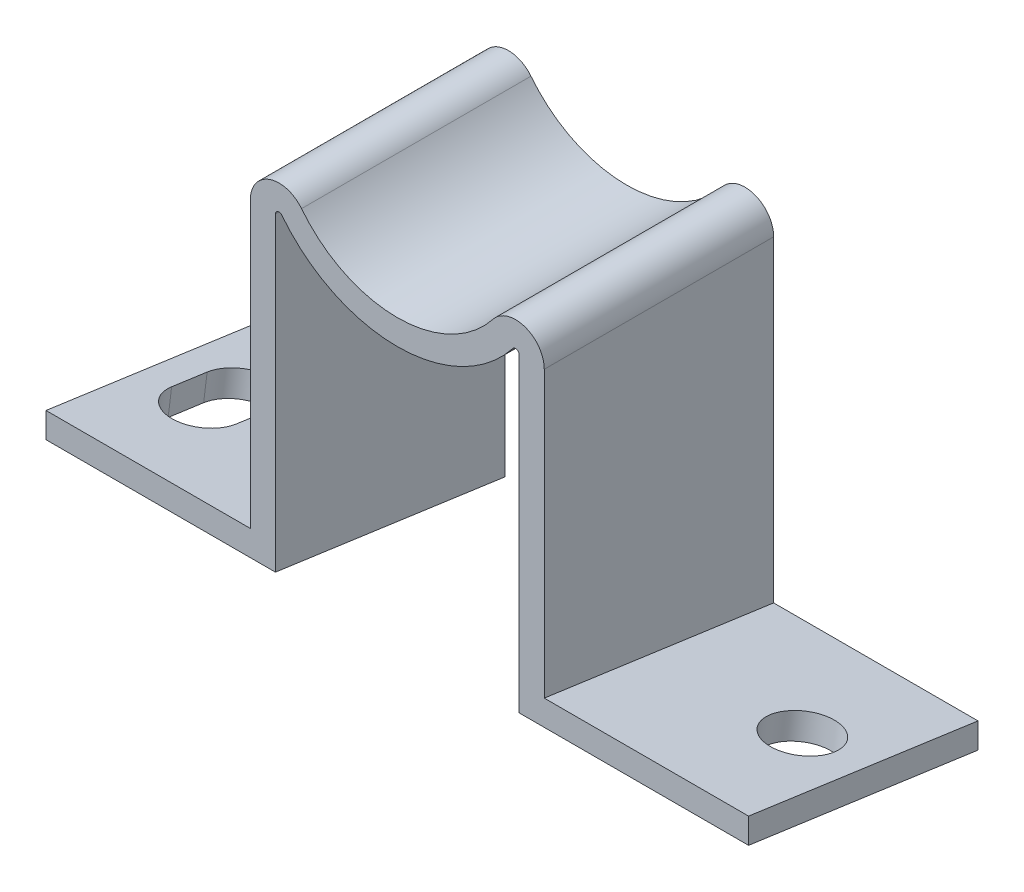
ISO-10303-21;
HEADER;
FILE_DESCRIPTION(('STEP AP214'),'2;1');
FILE_NAME('part.step','',(''),(''),'','','');
FILE_SCHEMA(('AUTOMOTIVE_DESIGN { 1 0 10303 214 1 1 1 1 }'));
ENDSEC;
DATA;
#1=APPLICATION_CONTEXT('core data for automotive mechanical design processes');
#2=APPLICATION_PROTOCOL_DEFINITION('international standard','automotive_design',2000,#1);
#3=PRODUCT_CONTEXT('',#1,'mechanical');
#4=PRODUCT('Part','Part','',(#3));
#5=PRODUCT_RELATED_PRODUCT_CATEGORY('part','',(#4));
#6=PRODUCT_DEFINITION_FORMATION('','',#4);
#7=PRODUCT_DEFINITION_CONTEXT('part definition',#1,'design');
#8=PRODUCT_DEFINITION('design','',#6,#7);
#9=PRODUCT_DEFINITION_SHAPE('','',#8);
#10=(LENGTH_UNIT() NAMED_UNIT(*) SI_UNIT(.MILLI.,.METRE.));
#11=(NAMED_UNIT(*) PLANE_ANGLE_UNIT() SI_UNIT($,.RADIAN.));
#12=(NAMED_UNIT(*) SI_UNIT($,.STERADIAN.) SOLID_ANGLE_UNIT());
#13=UNCERTAINTY_MEASURE_WITH_UNIT(LENGTH_MEASURE(1.E-05),#10,'distance_accuracy_value','');
#14=(GEOMETRIC_REPRESENTATION_CONTEXT(3) GLOBAL_UNCERTAINTY_ASSIGNED_CONTEXT((#13)) GLOBAL_UNIT_ASSIGNED_CONTEXT((#10,
#11,#12)) REPRESENTATION_CONTEXT('',''));
#15=CARTESIAN_POINT('',(0.,0.,0.));
#16=DIRECTION('',(0.,0.,1.));
#17=DIRECTION('',(1.,0.,0.));
#18=AXIS2_PLACEMENT_3D('',#15,#16,#17);
#19=CARTESIAN_POINT('',(-20.5,-12.9903810567666,16.));
#20=DIRECTION('',(1.,0.,0.));
#21=DIRECTION('',(0.,1.,0.));
#22=AXIS2_PLACEMENT_3D('',#19,#20,#21);
#23=PLANE('',#22);
#24=DIRECTION('',(0.,-0.139173100960058,-0.990268068741571));
#25=VECTOR('',#24,1.);
#26=CARTESIAN_POINT('',(-20.5,-57.214256851423,-16.));
#27=LINE('',#26,#25);
#28=CARTESIAN_POINT('',(-20.5,-52.7169501409467,16.));
#29=VERTEX_POINT('',#28);
#30=CARTESIAN_POINT('',(-20.5,-57.214256851423,-16.));
#31=VERTEX_POINT('',#30);
#32=EDGE_CURVE('E235',#29,#31,#27,.T.);
#33=ORIENTED_EDGE('',*,*,#32,.F.);
#34=DIRECTION('',(0.,-1.,0.));
#35=VECTOR('',#34,1.);
#36=CARTESIAN_POINT('',(-20.5,-12.9903810567666,16.));
#37=LINE('',#36,#35);
#38=CARTESIAN_POINT('',(-20.5,-12.9903810567666,16.));
#39=VERTEX_POINT('',#38);
#40=EDGE_CURVE('E283',#39,#29,#37,.T.);
#41=ORIENTED_EDGE('',*,*,#40,.F.);
#42=DIRECTION('',(0.,0.,-1.));
#43=VECTOR('',#42,1.);
#44=CARTESIAN_POINT('',(-20.5,-12.9903810567666,16.));
#45=LINE('',#44,#43);
#46=CARTESIAN_POINT('',(-20.5,-12.9903810567666,-16.));
#47=VERTEX_POINT('',#46);
#48=EDGE_CURVE('E311',#39,#47,#45,.T.);
#49=ORIENTED_EDGE('',*,*,#48,.T.);
#50=DIRECTION('',(0.,-1.,0.));
#51=VECTOR('',#50,1.);
#52=CARTESIAN_POINT('',(-20.5,-12.9903810567666,-16.));
#53=LINE('',#52,#51);
#54=EDGE_CURVE('E306',#47,#31,#53,.T.);
#55=ORIENTED_EDGE('',*,*,#54,.T.);
#56=EDGE_LOOP('',(#33,#41,#49,#55));
#57=FACE_BOUND('',#56,.T.);
#58=ADVANCED_FACE('F35',(#57),#23,.F.);
#59=CARTESIAN_POINT('',(-16.5,-12.9903810567666,16.));
#60=DIRECTION('',(0.,0.,-1.));
#61=DIRECTION('',(-1.,0.,0.));
#62=AXIS2_PLACEMENT_3D('',#59,#60,#61);
#63=CYLINDRICAL_SURFACE('',#62,0.499999999999996);
#64=CARTESIAN_POINT('',(-16.5,-12.9903810567666,-16.));
#65=DIRECTION('',(0.,0.,-1.));
#66=DIRECTION('',(1.,0.,0.));
#67=AXIS2_PLACEMENT_3D('',#64,#65,#66);
#68=CIRCLE('',#67,0.499999999999996);
#69=CARTESIAN_POINT('',(-17.,-12.9903810567666,-16.));
#70=VERTEX_POINT('',#69);
#71=CARTESIAN_POINT('',(-16.1071428571429,-12.6810862697007,-16.));
#72=VERTEX_POINT('',#71);
#73=EDGE_CURVE('E263',#70,#72,#68,.T.);
#74=ORIENTED_EDGE('',*,*,#73,.T.);
#75=DIRECTION('',(0.,0.,-1.));
#76=VECTOR('',#75,1.);
#77=CARTESIAN_POINT('',(-16.1071428571429,-12.6810862697007,16.));
#78=LINE('',#77,#76);
#79=CARTESIAN_POINT('',(-16.1071428571429,-12.6810862697007,16.));
#80=VERTEX_POINT('',#79);
#81=EDGE_CURVE('E328',#80,#72,#78,.T.);
#82=ORIENTED_EDGE('',*,*,#81,.F.);
#83=CARTESIAN_POINT('',(-16.5,-12.9903810567666,16.));
#84=DIRECTION('',(0.,0.,-1.));
#85=DIRECTION('',(1.,0.,0.));
#86=AXIS2_PLACEMENT_3D('',#83,#84,#85);
#87=CIRCLE('',#86,0.499999999999996);
#88=CARTESIAN_POINT('',(-17.,-12.9903810567666,16.));
#89=VERTEX_POINT('',#88);
#90=EDGE_CURVE('E264',#89,#80,#87,.T.);
#91=ORIENTED_EDGE('',*,*,#90,.F.);
#92=DIRECTION('',(0.,0.,-1.));
#93=VECTOR('',#92,1.);
#94=CARTESIAN_POINT('',(-17.,-12.9903810567666,16.));
#95=LINE('',#94,#93);
#96=EDGE_CURVE('E288',#89,#70,#95,.T.);
#97=ORIENTED_EDGE('',*,*,#96,.T.);
#98=EDGE_LOOP('',(#74,#82,#91,#97));
#99=FACE_BOUND('',#98,.T.);
#100=ADVANCED_FACE('F37',(#99),#63,.F.);
#101=CARTESIAN_POINT('',(0.,0.,16.));
#102=DIRECTION('',(0.,0.,-1.));
#103=DIRECTION('',(-1.,0.,0.));
#104=AXIS2_PLACEMENT_3D('',#101,#102,#103);
#105=CYLINDRICAL_SURFACE('',#104,20.5);
#106=CARTESIAN_POINT('',(0.,0.,-16.));
#107=DIRECTION('',(0.,0.,1.));
#108=DIRECTION('',(1.,0.,0.));
#109=AXIS2_PLACEMENT_3D('',#106,#107,#108);
#110=CIRCLE('',#109,20.5);
#111=CARTESIAN_POINT('',(16.1071428571429,-12.6810862697007,-16.));
#112=VERTEX_POINT('',#111);
#113=EDGE_CURVE('E291',#72,#112,#110,.T.);
#114=ORIENTED_EDGE('',*,*,#113,.T.);
#115=DIRECTION('',(0.,0.,-1.));
#116=VECTOR('',#115,1.);
#117=CARTESIAN_POINT('',(16.1071428571429,-12.6810862697007,16.));
#118=LINE('',#117,#116);
#119=CARTESIAN_POINT('',(16.1071428571429,-12.6810862697007,16.));
#120=VERTEX_POINT('',#119);
#121=EDGE_CURVE('E326',#120,#112,#118,.T.);
#122=ORIENTED_EDGE('',*,*,#121,.F.);
#123=CARTESIAN_POINT('',(0.,0.,16.));
#124=DIRECTION('',(0.,0.,1.));
#125=DIRECTION('',(1.,0.,0.));
#126=AXIS2_PLACEMENT_3D('',#123,#124,#125);
#127=CIRCLE('',#126,20.5);
#128=EDGE_CURVE('E267',#80,#120,#127,.T.);
#129=ORIENTED_EDGE('',*,*,#128,.F.);
#130=ORIENTED_EDGE('',*,*,#81,.T.);
#131=EDGE_LOOP('',(#114,#122,#129,#130));
#132=FACE_BOUND('',#131,.T.);
#133=ADVANCED_FACE('F390',(#132),#105,.T.);
#134=CARTESIAN_POINT('',(16.5,-12.9903810567666,16.));
#135=DIRECTION('',(0.,0.,-1.));
#136=DIRECTION('',(-1.,0.,0.));
#137=AXIS2_PLACEMENT_3D('',#134,#135,#136);
#138=CYLINDRICAL_SURFACE('',#137,0.499999999999996);
#139=CARTESIAN_POINT('',(16.5,-12.9903810567666,-16.));
#140=DIRECTION('',(0.,0.,-1.));
#141=DIRECTION('',(-1.,0.,0.));
#142=AXIS2_PLACEMENT_3D('',#139,#140,#141);
#143=CIRCLE('',#142,0.499999999999996);
#144=CARTESIAN_POINT('',(17.,-12.9903810567666,-16.));
#145=VERTEX_POINT('',#144);
#146=EDGE_CURVE('E293',#112,#145,#143,.T.);
#147=ORIENTED_EDGE('',*,*,#146,.T.);
#148=DIRECTION('',(0.,0.,-1.));
#149=VECTOR('',#148,1.);
#150=CARTESIAN_POINT('',(17.,-12.9903810567666,16.));
#151=LINE('',#150,#149);
#152=CARTESIAN_POINT('',(17.,-12.9903810567666,16.));
#153=VERTEX_POINT('',#152);
#154=EDGE_CURVE('E323',#153,#145,#151,.T.);
#155=ORIENTED_EDGE('',*,*,#154,.F.);
#156=CARTESIAN_POINT('',(16.5,-12.9903810567666,16.));
#157=DIRECTION('',(0.,0.,-1.));
#158=DIRECTION('',(-1.,0.,0.));
#159=AXIS2_PLACEMENT_3D('',#156,#157,#158);
#160=CIRCLE('',#159,0.499999999999996);
#161=EDGE_CURVE('E270',#120,#153,#160,.T.);
#162=ORIENTED_EDGE('',*,*,#161,.F.);
#163=ORIENTED_EDGE('',*,*,#121,.T.);
#164=EDGE_LOOP('',(#147,#155,#162,#163));
#165=FACE_BOUND('',#164,.T.);
#166=ADVANCED_FACE('F388',(#165),#138,.F.);
#167=CARTESIAN_POINT('',(17.,-12.9903810567666,16.));
#168=DIRECTION('',(1.,0.,0.));
#169=DIRECTION('',(0.,1.,0.));
#170=AXIS2_PLACEMENT_3D('',#167,#168,#169);
#171=PLANE('',#170);
#172=DIRECTION('',(0.,-1.,0.));
#173=VECTOR('',#172,1.);
#174=CARTESIAN_POINT('',(17.,-12.9903810567666,-16.));
#175=LINE('',#174,#173);
#176=CARTESIAN_POINT('',(17.,-60.7486533552382,-16.));
#177=VERTEX_POINT('',#176);
#178=EDGE_CURVE('E295',#145,#177,#175,.T.);
#179=ORIENTED_EDGE('',*,*,#178,.T.);
#180=DIRECTION('',(0.,0.139173100960058,0.990268068741571));
#181=VECTOR('',#180,1.);
#182=CARTESIAN_POINT('',(17.,-55.4134184252871,21.9621690823823));
#183=LINE('',#182,#181);
#184=CARTESIAN_POINT('',(17.,-56.2513466447619,16.));
#185=VERTEX_POINT('',#184);
#186=EDGE_CURVE('E260',#177,#185,#183,.T.);
#187=ORIENTED_EDGE('',*,*,#186,.T.);
#188=DIRECTION('',(0.,-1.,0.));
#189=VECTOR('',#188,1.);
#190=CARTESIAN_POINT('',(17.,-12.9903810567666,16.));
#191=LINE('',#190,#189);
#192=EDGE_CURVE('E272',#153,#185,#191,.T.);
#193=ORIENTED_EDGE('',*,*,#192,.F.);
#194=ORIENTED_EDGE('',*,*,#154,.T.);
#195=EDGE_LOOP('',(#179,#187,#193,#194));
#196=FACE_BOUND('',#195,.T.);
#197=ADVANCED_FACE('F383',(#196),#171,.F.);
#198=CARTESIAN_POINT('',(20.5,-12.9903810567666,16.));
#199=DIRECTION('',(-1.,0.,0.));
#200=DIRECTION('',(0.,-1.,0.));
#201=AXIS2_PLACEMENT_3D('',#198,#199,#200);
#202=PLANE('',#201);
#203=DIRECTION('',(0.,1.,0.));
#204=VECTOR('',#203,1.);
#205=CARTESIAN_POINT('',(20.5,-12.9903810567666,16.));
#206=LINE('',#205,#204);
#207=CARTESIAN_POINT('',(20.5,-52.7169501409467,16.));
#208=VERTEX_POINT('',#207);
#209=CARTESIAN_POINT('',(20.5,-12.9903810567666,16.));
#210=VERTEX_POINT('',#209);
#211=EDGE_CURVE('E275',#208,#210,#206,.T.);
#212=ORIENTED_EDGE('',*,*,#211,.F.);
#213=DIRECTION('',(0.,-0.139173100960058,-0.990268068741571));
#214=VECTOR('',#213,1.);
#215=CARTESIAN_POINT('',(20.5,-57.214256851423,-16.));
#216=LINE('',#215,#214);
#217=CARTESIAN_POINT('',(20.5,-57.214256851423,-16.));
#218=VERTEX_POINT('',#217);
#219=EDGE_CURVE('E215',#208,#218,#216,.T.);
#220=ORIENTED_EDGE('',*,*,#219,.T.);
#221=DIRECTION('',(0.,1.,0.));
#222=VECTOR('',#221,1.);
#223=CARTESIAN_POINT('',(20.5,-12.9903810567666,-16.));
#224=LINE('',#223,#222);
#225=CARTESIAN_POINT('',(20.5,-12.9903810567666,-16.));
#226=VERTEX_POINT('',#225);
#227=EDGE_CURVE('E298',#218,#226,#224,.T.);
#228=ORIENTED_EDGE('',*,*,#227,.T.);
#229=DIRECTION('',(0.,0.,-1.));
#230=VECTOR('',#229,1.);
#231=CARTESIAN_POINT('',(20.5,-12.9903810567666,16.));
#232=LINE('',#231,#230);
#233=EDGE_CURVE('E320',#210,#226,#232,.T.);
#234=ORIENTED_EDGE('',*,*,#233,.F.);
#235=EDGE_LOOP('',(#212,#220,#228,#234));
#236=FACE_BOUND('',#235,.T.);
#237=ADVANCED_FACE('F368',(#236),#202,.F.);
#238=CARTESIAN_POINT('',(16.5,-12.9903810567666,16.));
#239=DIRECTION('',(0.,0.,-1.));
#240=DIRECTION('',(-1.,0.,0.));
#241=AXIS2_PLACEMENT_3D('',#238,#239,#240);
#242=CYLINDRICAL_SURFACE('',#241,4.);
#243=CARTESIAN_POINT('',(16.5,-12.9903810567666,-16.));
#244=DIRECTION('',(0.,0.,1.));
#245=DIRECTION('',(-1.,0.,0.));
#246=AXIS2_PLACEMENT_3D('',#243,#244,#245);
#247=CIRCLE('',#246,4.);
#248=CARTESIAN_POINT('',(13.3571428571429,-10.5160227602396,-16.));
#249=VERTEX_POINT('',#248);
#250=EDGE_CURVE('E300',#226,#249,#247,.T.);
#251=ORIENTED_EDGE('',*,*,#250,.T.);
#252=DIRECTION('',(0.,0.,-1.));
#253=VECTOR('',#252,1.);
#254=CARTESIAN_POINT('',(13.3571428571429,-10.5160227602396,16.));
#255=LINE('',#254,#253);
#256=CARTESIAN_POINT('',(13.3571428571429,-10.5160227602396,16.));
#257=VERTEX_POINT('',#256);
#258=EDGE_CURVE('E317',#257,#249,#255,.T.);
#259=ORIENTED_EDGE('',*,*,#258,.F.);
#260=CARTESIAN_POINT('',(16.5,-12.9903810567666,16.));
#261=DIRECTION('',(0.,0.,1.));
#262=DIRECTION('',(-1.,0.,0.));
#263=AXIS2_PLACEMENT_3D('',#260,#261,#262);
#264=CIRCLE('',#263,4.);
#265=EDGE_CURVE('E277',#210,#257,#264,.T.);
#266=ORIENTED_EDGE('',*,*,#265,.F.);
#267=ORIENTED_EDGE('',*,*,#233,.T.);
#268=EDGE_LOOP('',(#251,#259,#266,#267));
#269=FACE_BOUND('',#268,.T.);
#270=ADVANCED_FACE('F364',(#269),#242,.T.);
#271=CARTESIAN_POINT('',(0.,0.,16.));
#272=DIRECTION('',(0.,0.,-1.));
#273=DIRECTION('',(-1.,0.,0.));
#274=AXIS2_PLACEMENT_3D('',#271,#272,#273);
#275=CYLINDRICAL_SURFACE('',#274,17.);
#276=CARTESIAN_POINT('',(0.,0.,-16.));
#277=DIRECTION('',(0.,0.,-1.));
#278=DIRECTION('',(1.,0.,0.));
#279=AXIS2_PLACEMENT_3D('',#276,#277,#278);
#280=CIRCLE('',#279,17.);
#281=CARTESIAN_POINT('',(-13.3571428571429,-10.5160227602396,-16.));
#282=VERTEX_POINT('',#281);
#283=EDGE_CURVE('E302',#249,#282,#280,.T.);
#284=ORIENTED_EDGE('',*,*,#283,.T.);
#285=DIRECTION('',(0.,0.,-1.));
#286=VECTOR('',#285,1.);
#287=CARTESIAN_POINT('',(-13.3571428571429,-10.5160227602396,16.));
#288=LINE('',#287,#286);
#289=CARTESIAN_POINT('',(-13.3571428571429,-10.5160227602396,16.));
#290=VERTEX_POINT('',#289);
#291=EDGE_CURVE('E314',#290,#282,#288,.T.);
#292=ORIENTED_EDGE('',*,*,#291,.F.);
#293=CARTESIAN_POINT('',(0.,0.,16.));
#294=DIRECTION('',(0.,0.,-1.));
#295=DIRECTION('',(1.,0.,0.));
#296=AXIS2_PLACEMENT_3D('',#293,#294,#295);
#297=CIRCLE('',#296,17.);
#298=EDGE_CURVE('E279',#257,#290,#297,.T.);
#299=ORIENTED_EDGE('',*,*,#298,.F.);
#300=ORIENTED_EDGE('',*,*,#258,.T.);
#301=EDGE_LOOP('',(#284,#292,#299,#300));
#302=FACE_BOUND('',#301,.T.);
#303=ADVANCED_FACE('F360',(#302),#275,.F.);
#304=CARTESIAN_POINT('',(-16.5,-12.9903810567666,16.));
#305=DIRECTION('',(0.,0.,-1.));
#306=DIRECTION('',(-1.,0.,0.));
#307=AXIS2_PLACEMENT_3D('',#304,#305,#306);
#308=CYLINDRICAL_SURFACE('',#307,4.);
#309=CARTESIAN_POINT('',(-16.5,-12.9903810567666,-16.));
#310=DIRECTION('',(0.,0.,1.));
#311=DIRECTION('',(1.,0.,0.));
#312=AXIS2_PLACEMENT_3D('',#309,#310,#311);
#313=CIRCLE('',#312,4.);
#314=EDGE_CURVE('E304',#282,#47,#313,.T.);
#315=ORIENTED_EDGE('',*,*,#314,.T.);
#316=ORIENTED_EDGE('',*,*,#48,.F.);
#317=CARTESIAN_POINT('',(-16.5,-12.9903810567666,16.));
#318=DIRECTION('',(0.,0.,1.));
#319=DIRECTION('',(1.,0.,0.));
#320=AXIS2_PLACEMENT_3D('',#317,#318,#319);
#321=CIRCLE('',#320,4.);
#322=EDGE_CURVE('E281',#290,#39,#321,.T.);
#323=ORIENTED_EDGE('',*,*,#322,.F.);
#324=ORIENTED_EDGE('',*,*,#291,.T.);
#325=EDGE_LOOP('',(#315,#316,#323,#324));
#326=FACE_BOUND('',#325,.T.);
#327=ADVANCED_FACE('F356',(#326),#308,.T.);
#328=CARTESIAN_POINT('',(-17.,-12.9903810567666,16.));
#329=DIRECTION('',(-1.,0.,0.));
#330=DIRECTION('',(0.,-1.,0.));
#331=AXIS2_PLACEMENT_3D('',#328,#329,#330);
#332=PLANE('',#331);
#333=DIRECTION('',(0.,1.,0.));
#334=VECTOR('',#333,1.);
#335=CARTESIAN_POINT('',(-17.,-12.9903810567666,16.));
#336=LINE('',#335,#334);
#337=CARTESIAN_POINT('',(-17.,-56.2513466447619,16.));
#338=VERTEX_POINT('',#337);
#339=EDGE_CURVE('E286',#338,#89,#336,.T.);
#340=ORIENTED_EDGE('',*,*,#339,.F.);
#341=DIRECTION('',(0.,-0.139173100960058,-0.990268068741571));
#342=VECTOR('',#341,1.);
#343=CARTESIAN_POINT('',(-17.,-55.4134184252871,21.9621690823823));
#344=LINE('',#343,#342);
#345=CARTESIAN_POINT('',(-17.,-60.7486533552382,-16.));
#346=VERTEX_POINT('',#345);
#347=EDGE_CURVE('E257',#338,#346,#344,.T.);
#348=ORIENTED_EDGE('',*,*,#347,.T.);
#349=DIRECTION('',(0.,1.,0.));
#350=VECTOR('',#349,1.);
#351=CARTESIAN_POINT('',(-17.,-12.9903810567666,-16.));
#352=LINE('',#351,#350);
#353=EDGE_CURVE('E268',#346,#70,#352,.T.);
#354=ORIENTED_EDGE('',*,*,#353,.T.);
#355=ORIENTED_EDGE('',*,*,#96,.F.);
#356=EDGE_LOOP('',(#340,#348,#354,#355));
#357=FACE_BOUND('',#356,.T.);
#358=ADVANCED_FACE('F398',(#357),#332,.F.);
#359=CARTESIAN_POINT('',(-16.5,-12.9903810567666,16.));
#360=DIRECTION('',(0.,0.,1.));
#361=DIRECTION('',(1.,0.,0.));
#362=AXIS2_PLACEMENT_3D('',#359,#360,#361);
#363=PLANE('',#362);
#364=DIRECTION('',(1.,0.,0.));
#365=VECTOR('',#364,1.);
#366=CARTESIAN_POINT('',(-50.,-56.2513466447619,16.));
#367=LINE('',#366,#365);
#368=CARTESIAN_POINT('',(49.,-56.2513466447619,16.));
#369=VERTEX_POINT('',#368);
#370=EDGE_CURVE('E254',#185,#369,#367,.T.);
#371=ORIENTED_EDGE('',*,*,#370,.T.);
#372=DIRECTION('',(0.,1.,0.));
#373=VECTOR('',#372,1.);
#374=CARTESIAN_POINT('',(49.,-56.2513466447619,16.));
#375=LINE('',#374,#373);
#376=CARTESIAN_POINT('',(49.,-52.7169501409467,16.));
#377=VERTEX_POINT('',#376);
#378=EDGE_CURVE('E222',#369,#377,#375,.T.);
#379=ORIENTED_EDGE('',*,*,#378,.T.);
#380=DIRECTION('',(-1.,0.,0.));
#381=VECTOR('',#380,1.);
#382=CARTESIAN_POINT('',(49.,-52.7169501409467,16.));
#383=LINE('',#382,#381);
#384=EDGE_CURVE('E228',#377,#208,#383,.T.);
#385=ORIENTED_EDGE('',*,*,#384,.T.);
#386=ORIENTED_EDGE('',*,*,#211,.T.);
#387=ORIENTED_EDGE('',*,*,#265,.T.);
#388=ORIENTED_EDGE('',*,*,#298,.T.);
#389=ORIENTED_EDGE('',*,*,#322,.T.);
#390=ORIENTED_EDGE('',*,*,#40,.T.);
#391=DIRECTION('',(1.,0.,0.));
#392=VECTOR('',#391,1.);
#393=CARTESIAN_POINT('',(-49.,-52.7169501409467,16.));
#394=LINE('',#393,#392);
#395=CARTESIAN_POINT('',(-49.,-52.7169501409467,16.));
#396=VERTEX_POINT('',#395);
#397=EDGE_CURVE('E251',#396,#29,#394,.T.);
#398=ORIENTED_EDGE('',*,*,#397,.F.);
#399=DIRECTION('',(0.,1.,0.));
#400=VECTOR('',#399,1.);
#401=CARTESIAN_POINT('',(-49.,-56.2513466447619,16.));
#402=LINE('',#401,#400);
#403=CARTESIAN_POINT('',(-49.,-56.2513466447619,16.));
#404=VERTEX_POINT('',#403);
#405=EDGE_CURVE('E242',#404,#396,#402,.T.);
#406=ORIENTED_EDGE('',*,*,#405,.F.);
#407=EDGE_CURVE('E256',#404,#338,#367,.T.);
#408=ORIENTED_EDGE('',*,*,#407,.T.);
#409=ORIENTED_EDGE('',*,*,#339,.T.);
#410=ORIENTED_EDGE('',*,*,#90,.T.);
#411=ORIENTED_EDGE('',*,*,#128,.T.);
#412=ORIENTED_EDGE('',*,*,#161,.T.);
#413=ORIENTED_EDGE('',*,*,#192,.T.);
#414=EDGE_LOOP('',(#371,#379,#385,#386,#387,#388,#389,#390,#398,#406,#408,#409,#410,#411,#412,#413));
#415=FACE_BOUND('',#414,.T.);
#416=ADVANCED_FACE('F393',(#415),#363,.T.);
#417=CARTESIAN_POINT('',(-16.5,-12.9903810567666,-16.));
#418=DIRECTION('',(0.,0.,1.));
#419=DIRECTION('',(1.,0.,0.));
#420=AXIS2_PLACEMENT_3D('',#417,#418,#419);
#421=PLANE('',#420);
#422=ORIENTED_EDGE('',*,*,#227,.F.);
#423=DIRECTION('',(-1.,0.,0.));
#424=VECTOR('',#423,1.);
#425=CARTESIAN_POINT('',(49.,-57.214256851423,-16.));
#426=LINE('',#425,#424);
#427=CARTESIAN_POINT('',(49.,-57.214256851423,-16.));
#428=VERTEX_POINT('',#427);
#429=EDGE_CURVE('E232',#428,#218,#426,.T.);
#430=ORIENTED_EDGE('',*,*,#429,.F.);
#431=DIRECTION('',(0.,-1.,0.));
#432=VECTOR('',#431,1.);
#433=CARTESIAN_POINT('',(49.,-60.7486533552382,-16.));
#434=LINE('',#433,#432);
#435=CARTESIAN_POINT('',(49.,-60.7486533552382,-16.));
#436=VERTEX_POINT('',#435);
#437=EDGE_CURVE('E216',#428,#436,#434,.T.);
#438=ORIENTED_EDGE('',*,*,#437,.T.);
#439=DIRECTION('',(-1.,0.,0.));
#440=VECTOR('',#439,1.);
#441=CARTESIAN_POINT('',(-16.5,-60.7486533552382,-16.));
#442=LINE('',#441,#440);
#443=EDGE_CURVE('E11',#436,#177,#442,.T.);
#444=ORIENTED_EDGE('',*,*,#443,.T.);
#445=ORIENTED_EDGE('',*,*,#178,.F.);
#446=ORIENTED_EDGE('',*,*,#146,.F.);
#447=ORIENTED_EDGE('',*,*,#113,.F.);
#448=ORIENTED_EDGE('',*,*,#73,.F.);
#449=ORIENTED_EDGE('',*,*,#353,.F.);
#450=CARTESIAN_POINT('',(-49.,-60.7486533552382,-16.));
#451=VERTEX_POINT('',#450);
#452=EDGE_CURVE('E39',#346,#451,#442,.T.);
#453=ORIENTED_EDGE('',*,*,#452,.T.);
#454=DIRECTION('',(0.,-1.,0.));
#455=VECTOR('',#454,1.);
#456=CARTESIAN_POINT('',(-49.,-60.7486533552382,-16.));
#457=LINE('',#456,#455);
#458=CARTESIAN_POINT('',(-49.,-57.214256851423,-16.));
#459=VERTEX_POINT('',#458);
#460=EDGE_CURVE('E236',#459,#451,#457,.T.);
#461=ORIENTED_EDGE('',*,*,#460,.F.);
#462=DIRECTION('',(1.,0.,0.));
#463=VECTOR('',#462,1.);
#464=CARTESIAN_POINT('',(-49.,-57.214256851423,-16.));
#465=LINE('',#464,#463);
#466=EDGE_CURVE('E246',#459,#31,#465,.T.);
#467=ORIENTED_EDGE('',*,*,#466,.T.);
#468=ORIENTED_EDGE('',*,*,#54,.F.);
#469=ORIENTED_EDGE('',*,*,#314,.F.);
#470=ORIENTED_EDGE('',*,*,#283,.F.);
#471=ORIENTED_EDGE('',*,*,#250,.F.);
#472=EDGE_LOOP('',(#422,#430,#438,#444,#445,#446,#447,#448,#449,#453,#461,#467,#468,#469,#470,#471));
#473=FACE_BOUND('',#472,.T.);
#474=ADVANCED_FACE('F337',(#473),#421,.F.);
#475=CARTESIAN_POINT('',(-50.,-60.7486533552382,-16.));
#476=DIRECTION('',(0.,0.990268068741571,-0.139173100960058));
#477=DIRECTION('',(0.,0.139173100960058,0.990268068741571));
#478=AXIS2_PLACEMENT_3D('',#475,#476,#477);
#479=PLANE('',#478);
#480=DIRECTION('',(0.,-0.139173100960058,-0.990268068741571));
#481=VECTOR('',#480,1.);
#482=CARTESIAN_POINT('',(-36.,-60.7486533552382,-16.));
#483=LINE('',#482,#481);
#484=CARTESIAN_POINT('',(-36.,-58.0836089843802,2.96277602521413));
#485=VERTEX_POINT('',#484);
#486=CARTESIAN_POINT('',(-36.,-58.7794744891805,-1.98856431849373));
#487=VERTEX_POINT('',#486);
#488=EDGE_CURVE('E203',#485,#487,#483,.T.);
#489=ORIENTED_EDGE('',*,*,#488,.T.);
#490=CARTESIAN_POINT('',(-40.5,-58.7794744891805,-1.98856431849373));
#491=DIRECTION('',(0.,0.990268068741571,-0.139173100960058));
#492=DIRECTION('',(0.,0.139173100960058,0.990268068741571));
#493=AXIS2_PLACEMENT_3D('',#490,#491,#492);
#494=CIRCLE('',#493,4.5);
#495=CARTESIAN_POINT('',(-45.,-58.7794744891805,-1.98856431849373));
#496=VERTEX_POINT('',#495);
#497=EDGE_CURVE('E206',#487,#496,#494,.T.);
#498=ORIENTED_EDGE('',*,*,#497,.T.);
#499=DIRECTION('',(0.,0.139173100960058,0.990268068741571));
#500=VECTOR('',#499,1.);
#501=CARTESIAN_POINT('',(-45.,-60.7486533552382,-16.));
#502=LINE('',#501,#500);
#503=CARTESIAN_POINT('',(-45.,-58.0836089843802,2.96277602521412));
#504=VERTEX_POINT('',#503);
#505=EDGE_CURVE('E198',#496,#504,#502,.T.);
#506=ORIENTED_EDGE('',*,*,#505,.T.);
#507=CARTESIAN_POINT('',(-40.5,-58.0836089843802,2.96277602521413));
#508=DIRECTION('',(0.,0.990268068741571,-0.139173100960058));
#509=DIRECTION('',(0.,0.139173100960058,0.990268068741571));
#510=AXIS2_PLACEMENT_3D('',#507,#508,#509);
#511=CIRCLE('',#510,4.5);
#512=EDGE_CURVE('E178',#504,#485,#511,.T.);
#513=ORIENTED_EDGE('',*,*,#512,.T.);
#514=EDGE_LOOP('',(#489,#498,#506,#513));
#515=FACE_BOUND('',#514,.T.);
#516=ORIENTED_EDGE('',*,*,#452,.F.);
#517=ORIENTED_EDGE('',*,*,#347,.F.);
#518=ORIENTED_EDGE('',*,*,#407,.F.);
#519=DIRECTION('',(0.,0.139173100960058,0.990268068741571));
#520=VECTOR('',#519,1.);
#521=CARTESIAN_POINT('',(-49.,-60.7486533552382,-16.));
#522=LINE('',#521,#520);
#523=EDGE_CURVE('E239',#451,#404,#522,.T.);
#524=ORIENTED_EDGE('',*,*,#523,.F.);
#525=EDGE_LOOP('',(#516,#517,#518,#524));
#526=FACE_BOUND('',#525,.T.);
#527=ADVANCED_FACE('F340',(#515,#526),#479,.F.);
#528=CARTESIAN_POINT('',(40.5,-58.4315417367803,0.4871058533602));
#529=DIRECTION('',(0.,0.990268068741571,-0.139173100960058));
#530=DIRECTION('',(0.,0.139173100960058,0.990268068741571));
#531=AXIS2_PLACEMENT_3D('',#528,#529,#530);
#532=CIRCLE('',#531,4.5);
#533=CARTESIAN_POINT('',(40.5,-57.8052627824601,4.94331216269727));
#534=VERTEX_POINT('',#533);
#535=EDGE_CURVE('E212',#534,#534,#532,.T.);
#536=ORIENTED_EDGE('',*,*,#535,.T.);
#537=EDGE_LOOP('',(#536));
#538=FACE_BOUND('',#537,.T.);
#539=ORIENTED_EDGE('',*,*,#443,.F.);
#540=DIRECTION('',(0.,0.139173100960058,0.990268068741571));
#541=VECTOR('',#540,1.);
#542=CARTESIAN_POINT('',(49.,-60.7486533552382,-16.));
#543=LINE('',#542,#541);
#544=EDGE_CURVE('E225',#436,#369,#543,.T.);
#545=ORIENTED_EDGE('',*,*,#544,.T.);
#546=ORIENTED_EDGE('',*,*,#370,.F.);
#547=ORIENTED_EDGE('',*,*,#186,.F.);
#548=EDGE_LOOP('',(#539,#545,#546,#547));
#549=FACE_BOUND('',#548,.T.);
#550=ADVANCED_FACE('F379',(#538,#549),#479,.F.);
#551=CARTESIAN_POINT('',(-49.,-57.214256851423,-16.));
#552=DIRECTION('',(0.,-0.990268068741571,0.139173100960058));
#553=DIRECTION('',(0.,-0.139173100960058,-0.990268068741571));
#554=AXIS2_PLACEMENT_3D('',#551,#552,#553);
#555=PLANE('',#554);
#556=DIRECTION('',(0.,0.139173100960059,0.990268068741571));
#557=VECTOR('',#556,1.);
#558=CARTESIAN_POINT('',(-45.,-55.313536248585,-2.47567017185393));
#559=LINE('',#558,#557);
#560=CARTESIAN_POINT('',(-45.,-55.313536248585,-2.47567017185393));
#561=VERTEX_POINT('',#560);
#562=CARTESIAN_POINT('',(-45.,-54.6176707437847,2.47567017185393));
#563=VERTEX_POINT('',#562);
#564=EDGE_CURVE('E184',#561,#563,#559,.T.);
#565=ORIENTED_EDGE('',*,*,#564,.F.);
#566=CARTESIAN_POINT('',(-40.5,-55.313536248585,-2.47567017185393));
#567=DIRECTION('',(0.,0.990268068741571,-0.139173100960058));
#568=DIRECTION('',(0.,0.139173100960058,0.990268068741571));
#569=AXIS2_PLACEMENT_3D('',#566,#567,#568);
#570=CIRCLE('',#569,4.5);
#571=CARTESIAN_POINT('',(-36.,-55.313536248585,-2.47567017185393));
#572=VERTEX_POINT('',#571);
#573=EDGE_CURVE('E58',#572,#561,#570,.T.);
#574=ORIENTED_EDGE('',*,*,#573,.F.);
#575=DIRECTION('',(0.,-0.139173100960058,-0.990268068741571));
#576=VECTOR('',#575,1.);
#577=CARTESIAN_POINT('',(-36.,-55.313536248585,-2.47567017185393));
#578=LINE('',#577,#576);
#579=CARTESIAN_POINT('',(-36.,-54.6176707437847,2.47567017185393));
#580=VERTEX_POINT('',#579);
#581=EDGE_CURVE('E191',#580,#572,#578,.T.);
#582=ORIENTED_EDGE('',*,*,#581,.F.);
#583=CARTESIAN_POINT('',(-40.5,-54.6176707437847,2.47567017185393));
#584=DIRECTION('',(0.,0.990268068741571,-0.139173100960058));
#585=DIRECTION('',(0.,0.139173100960058,0.990268068741571));
#586=AXIS2_PLACEMENT_3D('',#583,#584,#585);
#587=CIRCLE('',#586,4.5);
#588=EDGE_CURVE('E175',#563,#580,#587,.T.);
#589=ORIENTED_EDGE('',*,*,#588,.F.);
#590=EDGE_LOOP('',(#565,#574,#582,#589));
#591=FACE_BOUND('',#590,.T.);
#592=ORIENTED_EDGE('',*,*,#32,.T.);
#593=ORIENTED_EDGE('',*,*,#466,.F.);
#594=DIRECTION('',(0.,-0.139173100960058,-0.990268068741571));
#595=VECTOR('',#594,1.);
#596=CARTESIAN_POINT('',(-49.,-57.214256851423,-16.));
#597=LINE('',#596,#595);
#598=EDGE_CURVE('E244',#396,#459,#597,.T.);
#599=ORIENTED_EDGE('',*,*,#598,.F.);
#600=ORIENTED_EDGE('',*,*,#397,.T.);
#601=EDGE_LOOP('',(#592,#593,#599,#600));
#602=FACE_BOUND('',#601,.T.);
#603=ADVANCED_FACE('F188',(#591,#602),#555,.F.);
#604=CARTESIAN_POINT('',(-49.,0.,0.));
#605=DIRECTION('',(1.,0.,0.));
#606=DIRECTION('',(0.,0.,-1.));
#607=AXIS2_PLACEMENT_3D('',#604,#605,#606);
#608=PLANE('',#607);
#609=ORIENTED_EDGE('',*,*,#460,.T.);
#610=ORIENTED_EDGE('',*,*,#523,.T.);
#611=ORIENTED_EDGE('',*,*,#405,.T.);
#612=ORIENTED_EDGE('',*,*,#598,.T.);
#613=EDGE_LOOP('',(#609,#610,#611,#612));
#614=FACE_BOUND('',#613,.T.);
#615=ADVANCED_FACE('F344',(#614),#608,.F.);
#616=CARTESIAN_POINT('',(49.,-57.214256851423,-16.));
#617=DIRECTION('',(0.,0.990268068741571,-0.139173100960058));
#618=DIRECTION('',(0.,0.139173100960058,0.990268068741571));
#619=AXIS2_PLACEMENT_3D('',#616,#617,#618);
#620=PLANE('',#619);
#621=CARTESIAN_POINT('',(40.5,-54.9656034961848,0.));
#622=DIRECTION('',(0.,0.990268068741571,-0.139173100960058));
#623=DIRECTION('',(0.,0.139173100960058,0.990268068741571));
#624=AXIS2_PLACEMENT_3D('',#621,#622,#623);
#625=CIRCLE('',#624,4.5);
#626=CARTESIAN_POINT('',(40.5,-54.3393245418646,4.45620630933707));
#627=VERTEX_POINT('',#626);
#628=EDGE_CURVE('E209',#627,#627,#625,.T.);
#629=ORIENTED_EDGE('',*,*,#628,.F.);
#630=EDGE_LOOP('',(#629));
#631=FACE_BOUND('',#630,.T.);
#632=ORIENTED_EDGE('',*,*,#219,.F.);
#633=ORIENTED_EDGE('',*,*,#384,.F.);
#634=DIRECTION('',(0.,-0.139173100960058,-0.990268068741571));
#635=VECTOR('',#634,1.);
#636=CARTESIAN_POINT('',(49.,-57.214256851423,-16.));
#637=LINE('',#636,#635);
#638=EDGE_CURVE('E219',#377,#428,#637,.T.);
#639=ORIENTED_EDGE('',*,*,#638,.T.);
#640=ORIENTED_EDGE('',*,*,#429,.T.);
#641=EDGE_LOOP('',(#632,#633,#639,#640));
#642=FACE_BOUND('',#641,.T.);
#643=ADVANCED_FACE('F371',(#631,#642),#620,.T.);
#644=CARTESIAN_POINT('',(49.,0.,0.));
#645=DIRECTION('',(-1.,0.,0.));
#646=DIRECTION('',(0.,0.,-1.));
#647=AXIS2_PLACEMENT_3D('',#644,#645,#646);
#648=PLANE('',#647);
#649=ORIENTED_EDGE('',*,*,#437,.F.);
#650=ORIENTED_EDGE('',*,*,#638,.F.);
#651=ORIENTED_EDGE('',*,*,#378,.F.);
#652=ORIENTED_EDGE('',*,*,#544,.F.);
#653=EDGE_LOOP('',(#649,#650,#651,#652));
#654=FACE_BOUND('',#653,.T.);
#655=ADVANCED_FACE('F376',(#654),#648,.F.);
#656=CARTESIAN_POINT('',(40.5,-83.1882434553196,3.96643337736165));
#657=DIRECTION('',(0.,0.990268068741571,-0.139173100960058));
#658=DIRECTION('',(0.,0.139173100960058,0.990268068741571));
#659=AXIS2_PLACEMENT_3D('',#656,#657,#658);
#660=CYLINDRICAL_SURFACE('',#659,4.5);
#661=ORIENTED_EDGE('',*,*,#628,.T.);
#662=EDGE_LOOP('',(#661));
#663=FACE_BOUND('',#662,.T.);
#664=ORIENTED_EDGE('',*,*,#535,.F.);
#665=EDGE_LOOP('',(#664));
#666=FACE_BOUND('',#665,.T.);
#667=ADVANCED_FACE('F525',(#663,#666),#660,.F.);
#668=CARTESIAN_POINT('',(-40.5,-83.5361762077198,1.49076320550772));
#669=DIRECTION('',(0.,0.990268068741571,-0.139173100960058));
#670=DIRECTION('',(0.,0.139173100960058,0.990268068741571));
#671=AXIS2_PLACEMENT_3D('',#668,#669,#670);
#672=CYLINDRICAL_SURFACE('',#671,4.5);
#673=DIRECTION('',(0.,0.990268068741571,-0.139173100960058));
#674=VECTOR('',#673,1.);
#675=CARTESIAN_POINT('',(-36.,-83.5361762077198,1.49076320550772));
#676=LINE('',#675,#674);
#677=EDGE_CURVE('E196',#487,#572,#676,.T.);
#678=ORIENTED_EDGE('',*,*,#677,.T.);
#679=ORIENTED_EDGE('',*,*,#573,.T.);
#680=DIRECTION('',(0.,0.990268068741571,-0.139173100960058));
#681=VECTOR('',#680,1.);
#682=CARTESIAN_POINT('',(-45.,-83.5361762077198,1.49076320550772));
#683=LINE('',#682,#681);
#684=EDGE_CURVE('E181',#496,#561,#683,.T.);
#685=ORIENTED_EDGE('',*,*,#684,.F.);
#686=ORIENTED_EDGE('',*,*,#497,.F.);
#687=EDGE_LOOP('',(#678,#679,#685,#686));
#688=FACE_BOUND('',#687,.T.);
#689=ADVANCED_FACE('F532',(#688),#672,.F.);
#690=CARTESIAN_POINT('',(-36.,-83.5361762077198,1.49076320550772));
#691=DIRECTION('',(1.,0.,0.));
#692=DIRECTION('',(0.,1.,0.));
#693=AXIS2_PLACEMENT_3D('',#690,#691,#692);
#694=PLANE('',#693);
#695=DIRECTION('',(0.,0.990268068741571,-0.139173100960058));
#696=VECTOR('',#695,1.);
#697=CARTESIAN_POINT('',(-36.,-82.8403107029195,6.44210354921558));
#698=LINE('',#697,#696);
#699=EDGE_CURVE('E180',#485,#580,#698,.T.);
#700=ORIENTED_EDGE('',*,*,#699,.T.);
#701=ORIENTED_EDGE('',*,*,#581,.T.);
#702=ORIENTED_EDGE('',*,*,#677,.F.);
#703=ORIENTED_EDGE('',*,*,#488,.F.);
#704=EDGE_LOOP('',(#700,#701,#702,#703));
#705=FACE_BOUND('',#704,.T.);
#706=ADVANCED_FACE('F540',(#705),#694,.F.);
#707=CARTESIAN_POINT('',(-40.5,-82.8403107029195,6.44210354921558));
#708=DIRECTION('',(0.,0.990268068741571,-0.139173100960058));
#709=DIRECTION('',(0.,0.139173100960058,0.990268068741571));
#710=AXIS2_PLACEMENT_3D('',#707,#708,#709);
#711=CYLINDRICAL_SURFACE('',#710,4.5);
#712=DIRECTION('',(0.,0.990268068741571,-0.139173100960058));
#713=VECTOR('',#712,1.);
#714=CARTESIAN_POINT('',(-45.,-82.8403107029195,6.44210354921558));
#715=LINE('',#714,#713);
#716=EDGE_CURVE('E50',#504,#563,#715,.T.);
#717=ORIENTED_EDGE('',*,*,#716,.T.);
#718=ORIENTED_EDGE('',*,*,#588,.T.);
#719=ORIENTED_EDGE('',*,*,#699,.F.);
#720=ORIENTED_EDGE('',*,*,#512,.F.);
#721=EDGE_LOOP('',(#717,#718,#719,#720));
#722=FACE_BOUND('',#721,.T.);
#723=ADVANCED_FACE('F172',(#722),#711,.F.);
#724=CARTESIAN_POINT('',(-45.,-83.5361762077198,1.49076320550772));
#725=DIRECTION('',(-1.,0.,0.));
#726=DIRECTION('',(0.,-1.,0.));
#727=AXIS2_PLACEMENT_3D('',#724,#725,#726);
#728=PLANE('',#727);
#729=ORIENTED_EDGE('',*,*,#684,.T.);
#730=ORIENTED_EDGE('',*,*,#564,.T.);
#731=ORIENTED_EDGE('',*,*,#716,.F.);
#732=ORIENTED_EDGE('',*,*,#505,.F.);
#733=EDGE_LOOP('',(#729,#730,#731,#732));
#734=FACE_BOUND('',#733,.T.);
#735=ADVANCED_FACE('F185',(#734),#728,.F.);
#736=CLOSED_SHELL('',(#58,#100,#133,#166,#197,#237,#270,#303,#327,#358,#416,#474,#527,#550,#603,
#615,#643,#655,#667,#689,#706,#723,#735));
#737=MANIFOLD_SOLID_BREP('B2',#736);
#738=ADVANCED_BREP_SHAPE_REPRESENTATION('',(#18,#737),#14);
#739=SHAPE_DEFINITION_REPRESENTATION(#9,#738);
ENDSEC;
END-ISO-10303-21;
